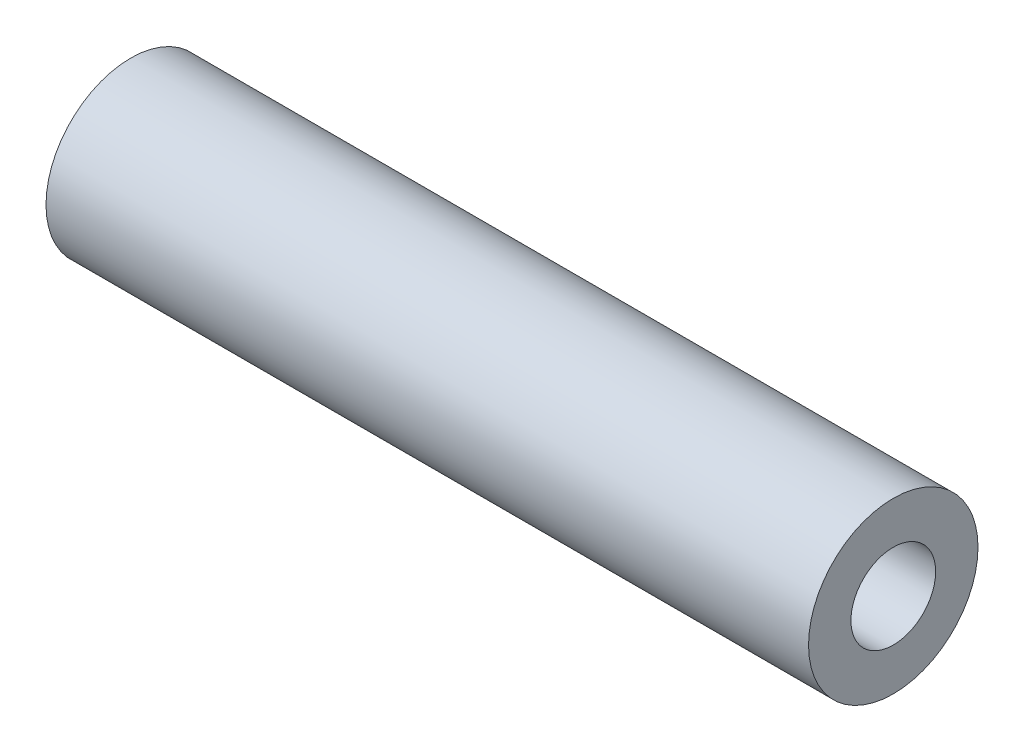
ISO-10303-21;
HEADER;
FILE_DESCRIPTION(('STEP AP214'),'2;1');
FILE_NAME('part.step','',(''),(''),'','','');
FILE_SCHEMA(('AUTOMOTIVE_DESIGN { 1 0 10303 214 1 1 1 1 }'));
ENDSEC;
DATA;
#1=APPLICATION_CONTEXT('core data for automotive mechanical design processes');
#2=APPLICATION_PROTOCOL_DEFINITION('international standard','automotive_design',2000,#1);
#3=PRODUCT_CONTEXT('',#1,'mechanical');
#4=PRODUCT('Part','Part','',(#3));
#5=PRODUCT_RELATED_PRODUCT_CATEGORY('part','',(#4));
#6=PRODUCT_DEFINITION_FORMATION('','',#4);
#7=PRODUCT_DEFINITION_CONTEXT('part definition',#1,'design');
#8=PRODUCT_DEFINITION('design','',#6,#7);
#9=PRODUCT_DEFINITION_SHAPE('','',#8);
#10=(LENGTH_UNIT() NAMED_UNIT(*) SI_UNIT(.MILLI.,.METRE.));
#11=(NAMED_UNIT(*) PLANE_ANGLE_UNIT() SI_UNIT($,.RADIAN.));
#12=(NAMED_UNIT(*) SI_UNIT($,.STERADIAN.) SOLID_ANGLE_UNIT());
#13=UNCERTAINTY_MEASURE_WITH_UNIT(LENGTH_MEASURE(1.E-05),#10,'distance_accuracy_value','');
#14=(GEOMETRIC_REPRESENTATION_CONTEXT(3) GLOBAL_UNCERTAINTY_ASSIGNED_CONTEXT((#13)) GLOBAL_UNIT_ASSIGNED_CONTEXT((#10,
#11,#12)) REPRESENTATION_CONTEXT('',''));
#15=CARTESIAN_POINT('',(0.,0.,0.));
#16=DIRECTION('',(0.,0.,1.));
#17=DIRECTION('',(1.,0.,0.));
#18=AXIS2_PLACEMENT_3D('',#15,#16,#17);
#19=CARTESIAN_POINT('',(57.15,0.,0.));
#20=DIRECTION('',(1.,0.,0.));
#21=DIRECTION('',(0.,0.,-1.));
#22=AXIS2_PLACEMENT_3D('',#19,#20,#21);
#23=PLANE('',#22);
#24=CARTESIAN_POINT('',(57.15,0.,0.));
#25=DIRECTION('',(1.,0.,0.));
#26=DIRECTION('',(0.,0.,-1.));
#27=AXIS2_PLACEMENT_3D('',#24,#25,#26);
#28=CIRCLE('',#27,6.35);
#29=CARTESIAN_POINT('',(57.15,0.,-6.35));
#30=VERTEX_POINT('',#29);
#31=EDGE_CURVE('E10',#30,#30,#28,.T.);
#32=ORIENTED_EDGE('',*,*,#31,.T.);
#33=EDGE_LOOP('',(#32));
#34=FACE_BOUND('',#33,.T.);
#35=CARTESIAN_POINT('',(57.15,0.,0.));
#36=DIRECTION('',(1.,0.,0.));
#37=DIRECTION('',(0.,0.,-1.));
#38=AXIS2_PLACEMENT_3D('',#35,#36,#37);
#39=CIRCLE('',#38,3.175);
#40=CARTESIAN_POINT('',(57.15,0.,-3.175));
#41=VERTEX_POINT('',#40);
#42=EDGE_CURVE('E44',#41,#41,#39,.T.);
#43=ORIENTED_EDGE('',*,*,#42,.F.);
#44=EDGE_LOOP('',(#43));
#45=FACE_BOUND('',#44,.T.);
#46=ADVANCED_FACE('F33',(#34,#45),#23,.T.);
#47=CARTESIAN_POINT('',(0.,0.,0.));
#48=DIRECTION('',(1.,0.,0.));
#49=DIRECTION('',(0.,0.,-1.));
#50=AXIS2_PLACEMENT_3D('',#47,#48,#49);
#51=PLANE('',#50);
#52=CARTESIAN_POINT('',(0.,0.,0.));
#53=DIRECTION('',(1.,0.,0.));
#54=DIRECTION('',(0.,0.,-1.));
#55=AXIS2_PLACEMENT_3D('',#52,#53,#54);
#56=CIRCLE('',#55,6.35);
#57=CARTESIAN_POINT('',(0.,0.,-6.35));
#58=VERTEX_POINT('',#57);
#59=EDGE_CURVE('E37',#58,#58,#56,.T.);
#60=ORIENTED_EDGE('',*,*,#59,.F.);
#61=EDGE_LOOP('',(#60));
#62=FACE_BOUND('',#61,.T.);
#63=CARTESIAN_POINT('',(0.,0.,0.));
#64=DIRECTION('',(1.,0.,0.));
#65=DIRECTION('',(0.,0.,-1.));
#66=AXIS2_PLACEMENT_3D('',#63,#64,#65);
#67=CIRCLE('',#66,3.175);
#68=CARTESIAN_POINT('',(0.,0.,-3.175));
#69=VERTEX_POINT('',#68);
#70=EDGE_CURVE('E46',#69,#69,#67,.T.);
#71=ORIENTED_EDGE('',*,*,#70,.T.);
#72=EDGE_LOOP('',(#71));
#73=FACE_BOUND('',#72,.T.);
#74=ADVANCED_FACE('F56',(#62,#73),#51,.F.);
#75=CARTESIAN_POINT('',(57.15,0.,0.));
#76=DIRECTION('',(-1.,0.,0.));
#77=DIRECTION('',(0.,0.,1.));
#78=AXIS2_PLACEMENT_3D('',#75,#76,#77);
#79=CYLINDRICAL_SURFACE('',#78,6.35);
#80=ORIENTED_EDGE('',*,*,#31,.F.);
#81=EDGE_LOOP('',(#80));
#82=FACE_BOUND('',#81,.T.);
#83=ORIENTED_EDGE('',*,*,#59,.T.);
#84=EDGE_LOOP('',(#83));
#85=FACE_BOUND('',#84,.T.);
#86=ADVANCED_FACE('F35',(#82,#85),#79,.T.);
#87=CARTESIAN_POINT('',(57.15,0.,0.));
#88=DIRECTION('',(-1.,0.,0.));
#89=DIRECTION('',(0.,0.,1.));
#90=AXIS2_PLACEMENT_3D('',#87,#88,#89);
#91=CYLINDRICAL_SURFACE('',#90,3.175);
#92=ORIENTED_EDGE('',*,*,#42,.T.);
#93=EDGE_LOOP('',(#92));
#94=FACE_BOUND('',#93,.T.);
#95=ORIENTED_EDGE('',*,*,#70,.F.);
#96=EDGE_LOOP('',(#95));
#97=FACE_BOUND('',#96,.T.);
#98=ADVANCED_FACE('F52',(#94,#97),#91,.F.);
#99=CLOSED_SHELL('',(#46,#74,#86,#98));
#100=MANIFOLD_SOLID_BREP('B2',#99);
#101=ADVANCED_BREP_SHAPE_REPRESENTATION('',(#18,#100),#14);
#102=SHAPE_DEFINITION_REPRESENTATION(#9,#101);
ENDSEC;
END-ISO-10303-21;
